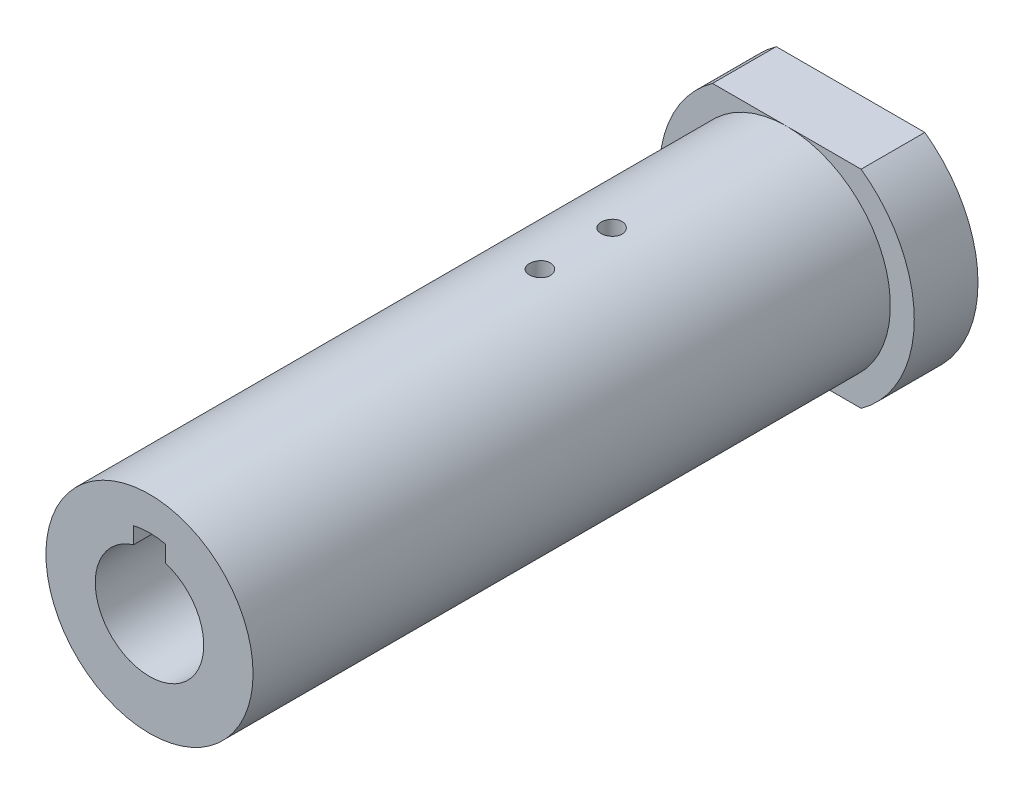
ISO-10303-21;
HEADER;
FILE_DESCRIPTION(('STEP AP214'),'2;1');
FILE_NAME('part.step','',(''),(''),'','','');
FILE_SCHEMA(('AUTOMOTIVE_DESIGN { 1 0 10303 214 1 1 1 1 }'));
ENDSEC;
DATA;
#1=APPLICATION_CONTEXT('core data for automotive mechanical design processes');
#2=APPLICATION_PROTOCOL_DEFINITION('international standard','automotive_design',2000,#1);
#3=PRODUCT_CONTEXT('',#1,'mechanical');
#4=PRODUCT('Part','Part','',(#3));
#5=PRODUCT_RELATED_PRODUCT_CATEGORY('part','',(#4));
#6=PRODUCT_DEFINITION_FORMATION('','',#4);
#7=PRODUCT_DEFINITION_CONTEXT('part definition',#1,'design');
#8=PRODUCT_DEFINITION('design','',#6,#7);
#9=PRODUCT_DEFINITION_SHAPE('','',#8);
#10=(LENGTH_UNIT() NAMED_UNIT(*) SI_UNIT(.MILLI.,.METRE.));
#11=(NAMED_UNIT(*) PLANE_ANGLE_UNIT() SI_UNIT($,.RADIAN.));
#12=(NAMED_UNIT(*) SI_UNIT($,.STERADIAN.) SOLID_ANGLE_UNIT());
#13=UNCERTAINTY_MEASURE_WITH_UNIT(LENGTH_MEASURE(1.E-05),#10,'distance_accuracy_value','');
#14=(GEOMETRIC_REPRESENTATION_CONTEXT(3) GLOBAL_UNCERTAINTY_ASSIGNED_CONTEXT((#13)) GLOBAL_UNIT_ASSIGNED_CONTEXT((#10,
#11,#12)) REPRESENTATION_CONTEXT('',''));
#15=CARTESIAN_POINT('',(0.,0.,0.));
#16=DIRECTION('',(0.,0.,1.));
#17=DIRECTION('',(1.,0.,0.));
#18=AXIS2_PLACEMENT_3D('',#15,#16,#17);
#19=CARTESIAN_POINT('',(0.,0.,139.7));
#20=DIRECTION('',(0.,0.,-1.));
#21=DIRECTION('',(-1.,0.,0.));
#22=AXIS2_PLACEMENT_3D('',#19,#20,#21);
#23=CYLINDRICAL_SURFACE('',#22,13.9954);
#24=CARTESIAN_POINT('',(0.,0.,76.2));
#25=DIRECTION('',(0.,0.,1.));
#26=DIRECTION('',(1.,0.,0.));
#27=AXIS2_PLACEMENT_3D('',#24,#25,#26);
#28=CIRCLE('',#27,13.9954);
#29=CARTESIAN_POINT('',(3.175,13.6305024177394,76.2));
#30=VERTEX_POINT('',#29);
#31=CARTESIAN_POINT('',(-3.175,13.6305024177394,76.2));
#32=VERTEX_POINT('',#31);
#33=EDGE_CURVE('E85',#30,#32,#28,.T.);
#34=ORIENTED_EDGE('',*,*,#33,.F.);
#35=DIRECTION('',(0.,0.,1.));
#36=VECTOR('',#35,1.);
#37=CARTESIAN_POINT('',(3.175,13.6305024177394,76.2));
#38=LINE('',#37,#36);
#39=CARTESIAN_POINT('',(3.175,13.6305024177394,139.7));
#40=VERTEX_POINT('',#39);
#41=EDGE_CURVE('E170',#30,#40,#38,.T.);
#42=ORIENTED_EDGE('',*,*,#41,.T.);
#43=CARTESIAN_POINT('',(0.,0.,139.7));
#44=DIRECTION('',(0.,0.,1.));
#45=DIRECTION('',(1.,0.,0.));
#46=AXIS2_PLACEMENT_3D('',#43,#44,#45);
#47=CIRCLE('',#46,13.9954);
#48=CARTESIAN_POINT('',(-3.175,13.6305024177394,139.7));
#49=VERTEX_POINT('',#48);
#50=EDGE_CURVE('E214',#40,#49,#47,.T.);
#51=ORIENTED_EDGE('',*,*,#50,.T.);
#52=DIRECTION('',(0.,0.,1.));
#53=VECTOR('',#52,1.);
#54=CARTESIAN_POINT('',(-3.175,13.6305024177394,76.2));
#55=LINE('',#54,#53);
#56=EDGE_CURVE('E81',#32,#49,#55,.T.);
#57=ORIENTED_EDGE('',*,*,#56,.F.);
#58=EDGE_LOOP('',(#34,#42,#51,#57));
#59=FACE_BOUND('',#58,.T.);
#60=ADVANCED_FACE('F59',(#59),#23,.F.);
#61=CARTESIAN_POINT('',(0.,0.,76.2));
#62=DIRECTION('',(0.,0.,-1.));
#63=DIRECTION('',(-1.,0.,0.));
#64=AXIS2_PLACEMENT_3D('',#61,#62,#63);
#65=CYLINDRICAL_SURFACE('',#64,20.6375);
#66=CARTESIAN_POINT('',(0.,20.6375,49.7078));
#67=CARTESIAN_POINT('',(-0.116673418011042,20.6374986459804,49.7077949504187));
#68=CARTESIAN_POINT('',(-0.233423834962747,20.636500074814,49.6979633475816));
#69=CARTESIAN_POINT('',(-0.463687496225415,20.6326125988908,49.6588917995434));
#70=CARTESIAN_POINT('',(-0.577197036868939,20.6297216151596,49.6296305086865));
#71=CARTESIAN_POINT('',(-0.797611189449056,20.6223756326464,49.5525604470288));
#72=CARTESIAN_POINT('',(-0.904519760143806,20.6179215821995,49.5047629205867));
#73=CARTESIAN_POINT('',(-1.10877358653536,20.6079474188847,49.3919991034111));
#74=CARTESIAN_POINT('',(-1.20612073002144,20.6024275170971,49.327036211158));
#75=CARTESIAN_POINT('',(-1.38886806487481,20.5909173135576,49.1815304450844));
#76=CARTESIAN_POINT('',(-1.47422832527567,20.5849255387146,49.1009375319585));
#77=CARTESIAN_POINT('',(-1.63023560796191,20.5731590705469,48.9265662119255));
#78=CARTESIAN_POINT('',(-1.70088194752998,20.5673843873054,48.8327871935288));
#79=CARTESIAN_POINT('',(-1.82559763940498,20.5566908826122,48.6344554959014));
#80=CARTESIAN_POINT('',(-1.8796308187165,20.5517739386998,48.5298799603165));
#81=CARTESIAN_POINT('',(-1.96935540647831,20.5433709090172,48.3130821855939));
#82=CARTESIAN_POINT('',(-2.00504727599724,20.539884787279,48.2008601387567));
#83=CARTESIAN_POINT('',(-2.05695761499952,20.5347514402553,47.9723623627359));
#84=CARTESIAN_POINT('',(-2.07324234681939,20.5330979590947,47.8561018299945));
#85=CARTESIAN_POINT('',(-2.0860809824995,20.5317976875389,47.6224868884926));
#86=CARTESIAN_POINT('',(-2.08263541399277,20.5321508434817,47.5051325090677));
#87=CARTESIAN_POINT('',(-2.0561658646637,20.534818231589,47.2731180686703));
#88=CARTESIAN_POINT('',(-2.03321425471611,20.5371252145984,47.1584496561484));
#89=CARTESIAN_POINT('',(-1.96849675189874,20.5434289934423,46.9346007427224));
#90=CARTESIAN_POINT('',(-1.92673060063094,20.5474258124849,46.8254203172129));
#91=CARTESIAN_POINT('',(-1.82548978907741,20.5566672575282,46.6154181219638));
#92=CARTESIAN_POINT('',(-1.76598304210207,20.561914140986,46.5146119244072));
#93=CARTESIAN_POINT('',(-1.63097327104134,20.5730626162391,46.3243901148623));
#94=CARTESIAN_POINT('',(-1.55546977004071,20.5789642275516,46.2349748426019));
#95=CARTESIAN_POINT('',(-1.39020565250953,20.5907894916058,46.0696525265471));
#96=CARTESIAN_POINT('',(-1.30038253874277,20.5967131243251,45.9938079425316));
#97=CARTESIAN_POINT('',(-1.10924589971797,20.6078899655561,45.8582641376088));
#98=CARTESIAN_POINT('',(-1.00793236121212,20.6131431732947,45.7985649353165));
#99=CARTESIAN_POINT('',(-0.79664735651349,20.6223890415078,45.6970089563934));
#100=CARTESIAN_POINT('',(-0.686674344828594,20.6263814763269,45.655155373334));
#101=CARTESIAN_POINT('',(-0.461212637273692,20.6326536611877,45.5905246049421));
#102=CARTESIAN_POINT('',(-0.345724109529263,20.6349334633989,45.5677468385269));
#103=CARTESIAN_POINT('',(-0.113050542441041,20.6375168043262,45.5419935754728));
#104=CARTESIAN_POINT('',(0.00412486606485471,20.6378289441684,45.5389318938097));
#105=CARTESIAN_POINT('',(0.237320905162869,20.6364648588707,45.5524713116496));
#106=CARTESIAN_POINT('',(0.353341551628187,20.6347886611004,45.5690721404968));
#107=CARTESIAN_POINT('',(0.580685727724372,20.6296417610507,45.6213938395537));
#108=CARTESIAN_POINT('',(0.692018643182737,20.6261748489762,45.657074331577));
#109=CARTESIAN_POINT('',(0.90711883716797,20.6178354352133,45.7465010066138));
#110=CARTESIAN_POINT('',(1.01088594303045,20.6129629014589,45.8002476017689));
#111=CARTESIAN_POINT('',(1.20829846251801,20.6023357846414,45.9244943803606));
#112=CARTESIAN_POINT('',(1.30190809449043,20.5965782457408,45.9950511594507));
#113=CARTESIAN_POINT('',(1.47598617206879,20.5848365970282,46.150834344618));
#114=CARTESIAN_POINT('',(1.55645428151322,20.5788524814251,46.2360611258409));
#115=CARTESIAN_POINT('',(1.70226458098479,20.5673062282623,46.4191412107419));
#116=CARTESIAN_POINT('',(1.76755018876891,20.5617457195553,46.5170396953866));
#117=CARTESIAN_POINT('',(1.88075322924861,20.5517010732555,46.7224614784268));
#118=CARTESIAN_POINT('',(1.9286709032521,20.5472169207081,46.8299846430723));
#119=CARTESIAN_POINT('',(2.00568324864352,20.5398428715695,47.0514099306058));
#120=CARTESIAN_POINT('',(2.03481152808786,20.5369501298389,47.1653002658317));
#121=CARTESIAN_POINT('',(2.07352725850035,20.5330775964736,47.3963860159647));
#122=CARTESIAN_POINT('',(2.08311528123521,20.5320977488658,47.5135813340633));
#123=CARTESIAN_POINT('',(2.08247030884604,20.5321631320961,47.74738789567));
#124=CARTESIAN_POINT('',(2.07232619736002,20.5331992818547,47.86399939709));
#125=CARTESIAN_POINT('',(2.03269133502858,20.53716054223,48.0938525781022));
#126=CARTESIAN_POINT('',(2.00320056295864,20.540085654919,48.2070942539975));
#127=CARTESIAN_POINT('',(1.92573414696349,20.5474927240546,48.4269922336439));
#128=CARTESIAN_POINT('',(1.87776116710576,20.5519744561174,48.5336494839195));
#129=CARTESIAN_POINT('',(1.76470126627152,20.5619902328133,48.7374123116306));
#130=CARTESIAN_POINT('',(1.69961443073725,20.5675242721927,48.8345179367499));
#131=CARTESIAN_POINT('',(1.55384072096024,20.5790509746715,49.016876534138));
#132=CARTESIAN_POINT('',(1.47308760985552,20.5850455173689,49.1020764406113));
#133=CARTESIAN_POINT('',(1.29840503046927,20.5968006473796,49.2577550507243));
#134=CARTESIAN_POINT('',(1.20447241243506,20.6025611783413,49.3282302252689));
#135=CARTESIAN_POINT('',(1.00583379018322,20.6132145818982,49.4526011168685));
#136=CARTESIAN_POINT('',(0.901100832066924,20.6181051964401,49.5064539457192));
#137=CARTESIAN_POINT('',(0.684095977927792,20.6264432455812,49.5957369223724));
#138=CARTESIAN_POINT('',(0.571832733792435,20.629892304573,49.6311878170491));
#139=CARTESIAN_POINT('',(0.382446435795857,20.6340931480584,49.6738325200026));
#140=CARTESIAN_POINT('',(0.306533516549245,20.6353647512845,49.6865528912934));
#141=CARTESIAN_POINT('',(0.15375821092186,20.6370686216807,49.7035382774639));
#142=CARTESIAN_POINT('',(0.0768958285488996,20.6375008923923,49.7078033280223));
#143=CARTESIAN_POINT('',(0.,20.6375,49.7078));
#144=B_SPLINE_CURVE_WITH_KNOTS('',3,(#66,#67,#68,#69,#70,#71,#72,#73,#74,#75,#76,#77,#78,#79,
#80,#81,#82,#83,#84,#85,#86,#87,#88,#89,#90,#91,#92,#93,#94,#95,#96,#97,#98,#99,#100,#101,#102,
#103,#104,#105,#106,#107,#108,#109,#110,#111,#112,#113,#114,#115,#116,#117,#118,#119,#120,#121,
#122,#123,#124,#125,#126,#127,#128,#129,#130,#131,#132,#133,#134,#135,#136,#137,#138,#139,#140,
#141,#142,#143),.UNSPECIFIED.,.T.,.F.,(4,2,2,2,2,2,2,2,2,2,2,2,2,2,2,2,2,2,2,2,2,2,2,2,2,2,2,2,
2,2,2,2,2,2,2,2,2,2,4),(0.,0.349739456527983,0.699863777554444,1.04977603930366,
1.39961907560476,1.75060119140743,2.10159958894878,2.45335691427366,2.80510539659808,
3.15564942154073,3.5061840721839,3.85542382632241,4.20466837704954,4.55454846432507,
4.90443898413191,5.25590063980617,5.60736270070037,5.95888763128523,6.31040185341468,
6.66037845052916,7.01035023025091,7.35958428093985,7.70882629923918,8.05926116987492,
8.40970500326762,8.76143466008964,9.11315942983642,9.46425332208431,9.81533694083982,
10.1648427609253,10.5143489644419,10.8638048081767,11.2132589072597,11.5642240277778,
11.9152731683018,12.2672206408273,12.6187704509955,12.8492738443756,13.0797762651019),.UNSPECIFIED.);
#145=CARTESIAN_POINT('',(0.,20.6375,49.7078));
#146=VERTEX_POINT('',#145);
#147=EDGE_CURVE('E226',#146,#146,#144,.T.);
#148=ORIENTED_EDGE('',*,*,#147,.T.);
#149=EDGE_LOOP('',(#148));
#150=FACE_BOUND('',#149,.T.);
#151=CARTESIAN_POINT('',(0.,20.6375,63.9953));
#152=CARTESIAN_POINT('',(-0.116673418011042,20.6374986459804,63.9952949504187));
#153=CARTESIAN_POINT('',(-0.233423834962747,20.636500074814,63.9854633475816));
#154=CARTESIAN_POINT('',(-0.463687496225415,20.6326125988908,63.9463917995434));
#155=CARTESIAN_POINT('',(-0.57719703686894,20.6297216151596,63.9171305086865));
#156=CARTESIAN_POINT('',(-0.797611189449061,20.6223756326464,63.8400604470288));
#157=CARTESIAN_POINT('',(-0.904519760143815,20.6179215821995,63.7922629205867));
#158=CARTESIAN_POINT('',(-1.10877358653537,20.6079474188847,63.6794991034111));
#159=CARTESIAN_POINT('',(-1.20612073002145,20.6024275170971,63.614536211158));
#160=CARTESIAN_POINT('',(-1.38886806487481,20.5909173135576,63.4690304450844));
#161=CARTESIAN_POINT('',(-1.47422832527567,20.5849255387146,63.3884375319585));
#162=CARTESIAN_POINT('',(-1.63023560796192,20.5731590705469,63.2140662119255));
#163=CARTESIAN_POINT('',(-1.70088194752998,20.5673843873054,63.1202871935288));
#164=CARTESIAN_POINT('',(-1.82559763940498,20.5566908826122,62.9219554959014));
#165=CARTESIAN_POINT('',(-1.87963081871651,20.5517739386998,62.8173799603165));
#166=CARTESIAN_POINT('',(-1.96935540647831,20.5433709090171,62.6005821855939));
#167=CARTESIAN_POINT('',(-2.00504727599724,20.539884787279,62.4883601387567));
#168=CARTESIAN_POINT('',(-2.05695761499952,20.5347514402553,62.2598623627359));
#169=CARTESIAN_POINT('',(-2.07324234681939,20.5330979590947,62.1436018299945));
#170=CARTESIAN_POINT('',(-2.0860809824995,20.5317976875389,61.9099868884926));
#171=CARTESIAN_POINT('',(-2.08263541399277,20.5321508434817,61.7926325090677));
#172=CARTESIAN_POINT('',(-2.0561658646637,20.534818231589,61.5606180686703));
#173=CARTESIAN_POINT('',(-2.03321425471611,20.5371252145984,61.4459496561484));
#174=CARTESIAN_POINT('',(-1.96849675189874,20.5434289934423,61.2221007427224));
#175=CARTESIAN_POINT('',(-1.92673060063094,20.5474258124849,61.1129203172129));
#176=CARTESIAN_POINT('',(-1.82548978907741,20.5566672575282,60.9029181219638));
#177=CARTESIAN_POINT('',(-1.76598304210206,20.561914140986,60.8021119244072));
#178=CARTESIAN_POINT('',(-1.63097327104134,20.5730626162391,60.6118901148623));
#179=CARTESIAN_POINT('',(-1.5554697700407,20.5789642275516,60.5224748426019));
#180=CARTESIAN_POINT('',(-1.39020565250953,20.5907894916058,60.3571525265471));
#181=CARTESIAN_POINT('',(-1.30038253874277,20.5967131243251,60.2813079425316));
#182=CARTESIAN_POINT('',(-1.10924589971797,20.6078899655561,60.1457641376088));
#183=CARTESIAN_POINT('',(-1.00793236121212,20.6131431732947,60.0860649353165));
#184=CARTESIAN_POINT('',(-0.796647356513486,20.6223890415078,59.9845089563934));
#185=CARTESIAN_POINT('',(-0.686674344828588,20.6263814763269,59.942655373334));
#186=CARTESIAN_POINT('',(-0.461212637273684,20.6326536611877,59.8780246049421));
#187=CARTESIAN_POINT('',(-0.345724109529257,20.6349334633989,59.8552468385269));
#188=CARTESIAN_POINT('',(-0.113050542441036,20.6375168043262,59.8294935754728));
#189=CARTESIAN_POINT('',(0.00412486606486031,20.6378289441684,59.8264318938097));
#190=CARTESIAN_POINT('',(0.237320905162875,20.6364648588707,59.8399713116496));
#191=CARTESIAN_POINT('',(0.353341551628194,20.6347886611004,59.8565721404968));
#192=CARTESIAN_POINT('',(0.580685727724378,20.6296417610507,59.9088938395537));
#193=CARTESIAN_POINT('',(0.692018643182742,20.6261748489762,59.944574331577));
#194=CARTESIAN_POINT('',(0.907118837167973,20.6178354352133,60.0340010066138));
#195=CARTESIAN_POINT('',(1.01088594303045,20.6129629014589,60.0877476017689));
#196=CARTESIAN_POINT('',(1.20829846251801,20.6023357846414,60.2119943803606));
#197=CARTESIAN_POINT('',(1.30190809449044,20.5965782457408,60.2825511594507));
#198=CARTESIAN_POINT('',(1.47598617206881,20.5848365970282,60.438334344618));
#199=CARTESIAN_POINT('',(1.55645428151322,20.5788524814251,60.5235611258409));
#200=CARTESIAN_POINT('',(1.70226458098479,20.5673062282623,60.7066412107419));
#201=CARTESIAN_POINT('',(1.76755018876891,20.5617457195553,60.8045396953866));
#202=CARTESIAN_POINT('',(1.88075322924861,20.5517010732555,61.0099614784268));
#203=CARTESIAN_POINT('',(1.9286709032521,20.5472169207081,61.1174846430723));
#204=CARTESIAN_POINT('',(2.00568324864353,20.5398428715695,61.3389099306059));
#205=CARTESIAN_POINT('',(2.03481152808786,20.5369501298389,61.4528002658317));
#206=CARTESIAN_POINT('',(2.07352725850035,20.5330775964736,61.6838860159648));
#207=CARTESIAN_POINT('',(2.08311528123521,20.5320977488658,61.8010813340633));
#208=CARTESIAN_POINT('',(2.08247030884604,20.5321631320961,62.0348878956701));
#209=CARTESIAN_POINT('',(2.07232619736002,20.5331992818547,62.15149939709));
#210=CARTESIAN_POINT('',(2.03269133502858,20.53716054223,62.3813525781022));
#211=CARTESIAN_POINT('',(2.00320056295864,20.540085654919,62.4945942539975));
#212=CARTESIAN_POINT('',(1.92573414696349,20.5474927240546,62.7144922336439));
#213=CARTESIAN_POINT('',(1.87776116710575,20.5519744561174,62.8211494839196));
#214=CARTESIAN_POINT('',(1.76470126627151,20.5619902328133,63.0249123116306));
#215=CARTESIAN_POINT('',(1.69961443073724,20.5675242721927,63.1220179367499));
#216=CARTESIAN_POINT('',(1.55384072096023,20.5790509746715,63.304376534138));
#217=CARTESIAN_POINT('',(1.47308760985551,20.5850455173689,63.3895764406113));
#218=CARTESIAN_POINT('',(1.29840503046926,20.5968006473796,63.5452550507243));
#219=CARTESIAN_POINT('',(1.20447241243505,20.6025611783413,63.6157302252689));
#220=CARTESIAN_POINT('',(1.00583379018322,20.6132145818982,63.7401011168685));
#221=CARTESIAN_POINT('',(0.901100832066918,20.6181051964401,63.7939539457192));
#222=CARTESIAN_POINT('',(0.684095977927787,20.6264432455812,63.8832369223724));
#223=CARTESIAN_POINT('',(0.571832733792429,20.629892304573,63.9186878170491));
#224=CARTESIAN_POINT('',(0.382446435795853,20.6340931480584,63.9613325200026));
#225=CARTESIAN_POINT('',(0.306533516549242,20.6353647512845,63.9740528912934));
#226=CARTESIAN_POINT('',(0.153758210921859,20.6370686216807,63.9910382774639));
#227=CARTESIAN_POINT('',(0.0768958285488988,20.6375008923923,63.9953033280223));
#228=CARTESIAN_POINT('',(0.,20.6375,63.9953));
#229=B_SPLINE_CURVE_WITH_KNOTS('',3,(#151,#152,#153,#154,#155,#156,#157,#158,#159,#160,#161,
#162,#163,#164,#165,#166,#167,#168,#169,#170,#171,#172,#173,#174,#175,#176,#177,#178,#179,#180,
#181,#182,#183,#184,#185,#186,#187,#188,#189,#190,#191,#192,#193,#194,#195,#196,#197,#198,#199,
#200,#201,#202,#203,#204,#205,#206,#207,#208,#209,#210,#211,#212,#213,#214,#215,#216,#217,#218,
#219,#220,#221,#222,#223,#224,#225,#226,#227,#228),.UNSPECIFIED.,.T.,.F.,(4,2,2,2,2,2,2,2,2,2,2,
2,2,2,2,2,2,2,2,2,2,2,2,2,2,2,2,2,2,2,2,2,2,2,2,2,2,2,4),(0.,0.349739456527983,
0.699863777554447,1.04977603930368,1.39961907560477,1.75060119140743,2.10159958894878,
2.45335691427367,2.80510539659808,3.15564942154073,3.5061840721839,3.85542382632242,
4.20466837704954,4.55454846432508,4.90443898413191,5.25590063980617,5.60736270070037,
5.95888763128524,6.31040185341469,6.66037845052916,7.01035023025092,7.35958428093986,
7.70882629923919,8.05926116987493,8.40970500326763,8.76143466008966,9.11315942983643,
9.46425332208432,9.81533694083982,10.1648427609253,10.5143489644419,10.8638048081768,
11.2132589072597,11.5642240277778,11.9152731683019,12.2672206408273,12.6187704509955,
12.8492738443756,13.0797762651019),.UNSPECIFIED.);
#230=CARTESIAN_POINT('',(0.,20.6375,63.9953));
#231=VERTEX_POINT('',#230);
#232=EDGE_CURVE('E164',#231,#231,#229,.T.);
#233=ORIENTED_EDGE('',*,*,#232,.T.);
#234=EDGE_LOOP('',(#233));
#235=FACE_BOUND('',#234,.T.);
#236=CARTESIAN_POINT('',(0.,0.,139.7));
#237=DIRECTION('',(0.,0.,1.));
#238=DIRECTION('',(1.,0.,0.));
#239=AXIS2_PLACEMENT_3D('',#236,#237,#238);
#240=CIRCLE('',#239,20.6375);
#241=CARTESIAN_POINT('',(20.6375,0.,139.7));
#242=VERTEX_POINT('',#241);
#243=EDGE_CURVE('E216',#242,#242,#240,.T.);
#244=ORIENTED_EDGE('',*,*,#243,.F.);
#245=EDGE_LOOP('',(#244));
#246=FACE_BOUND('',#245,.T.);
#247=CARTESIAN_POINT('',(0.,0.,12.7));
#248=DIRECTION('',(0.,0.,-1.));
#249=DIRECTION('',(-1.,0.,0.));
#250=AXIS2_PLACEMENT_3D('',#247,#248,#249);
#251=CIRCLE('',#250,20.6375);
#252=CARTESIAN_POINT('',(0.,-20.6375,12.7));
#253=VERTEX_POINT('',#252);
#254=CARTESIAN_POINT('',(0.,20.6375,12.7));
#255=VERTEX_POINT('',#254);
#256=EDGE_CURVE('E185',#253,#255,#251,.T.);
#257=ORIENTED_EDGE('',*,*,#256,.F.);
#258=CARTESIAN_POINT('',(0.,0.,12.7));
#259=DIRECTION('',(0.,0.,-1.));
#260=DIRECTION('',(-1.,0.,0.));
#261=AXIS2_PLACEMENT_3D('',#258,#259,#260);
#262=CIRCLE('',#261,20.6375);
#263=EDGE_CURVE('E198',#255,#253,#262,.T.);
#264=ORIENTED_EDGE('',*,*,#263,.F.);
#265=EDGE_LOOP('',(#257,#264));
#266=FACE_BOUND('',#265,.T.);
#267=ADVANCED_FACE('F61',(#150,#235,#246,#266),#65,.T.);
#268=CARTESIAN_POINT('',(0.,0.,0.));
#269=DIRECTION('',(0.,0.,1.));
#270=DIRECTION('',(1.,0.,0.));
#271=AXIS2_PLACEMENT_3D('',#268,#269,#270);
#272=PLANE('',#271);
#273=DIRECTION('',(-1.,0.,0.));
#274=VECTOR('',#273,1.);
#275=CARTESIAN_POINT('',(0.,-20.6375,0.));
#276=LINE('',#275,#274);
#277=CARTESIAN_POINT('',(14.8072142467785,-20.6375,0.));
#278=VERTEX_POINT('',#277);
#279=CARTESIAN_POINT('',(-14.8072142467785,-20.6375,0.));
#280=VERTEX_POINT('',#279);
#281=EDGE_CURVE('E207',#278,#280,#276,.T.);
#282=ORIENTED_EDGE('',*,*,#281,.T.);
#283=CARTESIAN_POINT('',(0.,0.,0.));
#284=DIRECTION('',(0.,0.,-1.));
#285=DIRECTION('',(-1.,0.,0.));
#286=AXIS2_PLACEMENT_3D('',#283,#284,#285);
#287=CIRCLE('',#286,25.4);
#288=CARTESIAN_POINT('',(-14.8072142467785,20.6375,0.));
#289=VERTEX_POINT('',#288);
#290=EDGE_CURVE('E169',#289,#280,#287,.F.);
#291=ORIENTED_EDGE('',*,*,#290,.F.);
#292=DIRECTION('',(-1.,0.,0.));
#293=VECTOR('',#292,1.);
#294=CARTESIAN_POINT('',(0.,20.6375,0.));
#295=LINE('',#294,#293);
#296=CARTESIAN_POINT('',(14.8072142467785,20.6375,0.));
#297=VERTEX_POINT('',#296);
#298=EDGE_CURVE('E195',#297,#289,#295,.T.);
#299=ORIENTED_EDGE('',*,*,#298,.F.);
#300=CARTESIAN_POINT('',(0.,0.,0.));
#301=DIRECTION('',(0.,0.,-1.));
#302=DIRECTION('',(-1.,0.,0.));
#303=AXIS2_PLACEMENT_3D('',#300,#301,#302);
#304=CIRCLE('',#303,25.4);
#305=EDGE_CURVE('E189',#278,#297,#304,.F.);
#306=ORIENTED_EDGE('',*,*,#305,.F.);
#307=EDGE_LOOP('',(#282,#291,#299,#306));
#308=FACE_BOUND('',#307,.T.);
#309=CARTESIAN_POINT('',(0.,0.,0.));
#310=DIRECTION('',(0.,0.,1.));
#311=DIRECTION('',(1.,0.,0.));
#312=AXIS2_PLACEMENT_3D('',#309,#310,#311);
#313=CIRCLE('',#312,15.875);
#314=CARTESIAN_POINT('',(15.875,0.,0.));
#315=VERTEX_POINT('',#314);
#316=EDGE_CURVE('E12',#315,#315,#313,.T.);
#317=ORIENTED_EDGE('',*,*,#316,.T.);
#318=EDGE_LOOP('',(#317));
#319=FACE_BOUND('',#318,.T.);
#320=ADVANCED_FACE('F257',(#308,#319),#272,.F.);
#321=CARTESIAN_POINT('',(0.,0.,76.2));
#322=DIRECTION('',(0.,0.,-1.));
#323=DIRECTION('',(-1.,0.,0.));
#324=AXIS2_PLACEMENT_3D('',#321,#322,#323);
#325=CYLINDRICAL_SURFACE('',#324,15.875);
#326=CARTESIAN_POINT('',(0.,15.875,49.7078));
#327=CARTESIAN_POINT('',(-0.116455193801769,15.8749983107207,49.7077950832706));
#328=CARTESIAN_POINT('',(-0.232981960090031,15.8737050594194,49.6980000532931));
#329=CARTESIAN_POINT('',(-0.46278958237329,15.8686704351037,49.6590822885931));
#330=CARTESIAN_POINT('',(-0.576066976997715,15.8649265457827,49.6299396874135));
#331=CARTESIAN_POINT('',(-0.796015917447345,15.855412174548,49.5532030640755));
#332=CARTESIAN_POINT('',(-0.902691977848529,15.8496430960647,49.5056218172968));
#333=CARTESIAN_POINT('',(-1.10652574470892,15.8367190198169,49.3933872951519));
#334=CARTESIAN_POINT('',(-1.20368500790217,15.8295642492924,49.3287368183431));
#335=CARTESIAN_POINT('',(-1.38633343961909,15.8146185468358,49.1837818690942));
#336=CARTESIAN_POINT('',(-1.47175681797913,15.8068243909682,49.1033948226165));
#337=CARTESIAN_POINT('',(-1.62794176935066,15.7915041832127,48.9294260533638));
#338=CARTESIAN_POINT('',(-1.69870257394012,15.7839781453931,48.8358436394903));
#339=CARTESIAN_POINT('',(-1.82380150817527,15.7700147106223,48.6377094928707));
#340=CARTESIAN_POINT('',(-1.87807750798419,15.7635814714985,48.5331182139728));
#341=CARTESIAN_POINT('',(-1.96826930375697,15.752574960099,48.3162065072552));
#342=CARTESIAN_POINT('',(-2.00418586553192,15.748001610245,48.203886402043));
#343=CARTESIAN_POINT('',(-2.05643824045801,15.7412637322438,47.975390568539));
#344=CARTESIAN_POINT('',(-2.07288553874911,15.7390854943352,47.8592407460422));
#345=CARTESIAN_POINT('',(-2.08607757465719,15.7373426043562,47.6258106981711));
#346=CARTESIAN_POINT('',(-2.08282318254673,15.7377778368425,47.5085305229557));
#347=CARTESIAN_POINT('',(-2.0567956376116,15.7412001659,47.2769483135576));
#348=CARTESIAN_POINT('',(-2.0341456024737,15.7441711657955,47.1626321703774));
#349=CARTESIAN_POINT('',(-1.9701619632951,15.7523051599738,46.9394373967269));
#350=CARTESIAN_POINT('',(-1.92882794565464,15.7574682027808,46.8305588866865));
#351=CARTESIAN_POINT('',(-1.82851832630454,15.7694226832183,46.6209493896568));
#352=CARTESIAN_POINT('',(-1.76948953710508,15.7762190178585,46.5202441464835));
#353=CARTESIAN_POINT('',(-1.63550399324765,15.7906705829124,46.3301220442862));
#354=CARTESIAN_POINT('',(-1.56054643645831,15.7983258565707,46.2407057541062));
#355=CARTESIAN_POINT('',(-1.39615030954059,15.8137042032064,46.0749853859938));
#356=CARTESIAN_POINT('',(-1.30660567921232,15.821427348069,45.9987864879984));
#357=CARTESIAN_POINT('',(-1.1159415662087,15.836016718836,45.8624839264925));
#358=CARTESIAN_POINT('',(-1.01482205201077,15.8428829424066,45.8023803068168));
#359=CARTESIAN_POINT('',(-0.803795145046001,15.8549897225195,45.6999731180769));
#360=CARTESIAN_POINT('',(-0.69388434621067,15.860229645098,45.6576764882396));
#361=CARTESIAN_POINT('',(-0.46843629095581,15.8684878004502,45.5921692526615));
#362=CARTESIAN_POINT('',(-0.352899325229191,15.8715061478786,45.5689576619404));
#363=CARTESIAN_POINT('',(-0.120387654676626,15.8749661002299,45.5424165356929));
#364=CARTESIAN_POINT('',(-0.00342974974721174,15.8754264738175,45.5389421776015));
#365=CARTESIAN_POINT('',(0.229400476390119,15.8737693779004,45.5515914394684));
#366=CARTESIAN_POINT('',(0.345272823060402,15.8716519690124,45.5677145985907));
#367=CARTESIAN_POINT('',(0.572212789335671,15.8650888885358,45.6189808740085));
#368=CARTESIAN_POINT('',(0.683296353739912,15.860651714468,45.654054588213));
#369=CARTESIAN_POINT('',(0.898005279374566,15.8499456490105,45.7421539663133));
#370=CARTESIAN_POINT('',(1.00163036399025,15.8436766897285,45.7951802956071));
#371=CARTESIAN_POINT('',(1.19912528572521,15.829958640534,45.918027604037));
#372=CARTESIAN_POINT('',(1.29293665396215,15.8225030785615,45.9879418450752));
#373=CARTESIAN_POINT('',(1.46754547257663,15.8072651538634,46.1424489183122));
#374=CARTESIAN_POINT('',(1.54834235138383,15.7994827768037,46.2270423948548));
#375=CARTESIAN_POINT('',(1.69514555129436,15.7844100585279,46.4091461908071));
#376=CARTESIAN_POINT('',(1.76105561581864,15.7771231211395,46.5067344307752));
#377=CARTESIAN_POINT('',(1.8755483218782,15.7639233392231,46.711681172659));
#378=CARTESIAN_POINT('',(1.92413134011834,15.7580104648228,46.8190394621018));
#379=CARTESIAN_POINT('',(2.00243655065204,15.7482518420474,47.0401736832784));
#380=CARTESIAN_POINT('',(2.03221217289402,15.7444002425988,47.1539304257761));
#381=CARTESIAN_POINT('',(2.07222900546333,15.7391837757775,47.3848832599816));
#382=CARTESIAN_POINT('',(2.08247122483133,15.737818779954,47.5020791737141));
#383=CARTESIAN_POINT('',(2.08311072460907,15.737734067321,47.7356255948397));
#384=CARTESIAN_POINT('',(2.07365924886421,15.7389941900828,47.8519757095752));
#385=CARTESIAN_POINT('',(2.03550081362729,15.743974278668,48.0814179842996));
#386=CARTESIAN_POINT('',(2.00679385882627,15.747694243892,48.1945101450822));
#387=CARTESIAN_POINT('',(1.93098811248074,15.7571684467508,48.4142011959106));
#388=CARTESIAN_POINT('',(1.88389737758497,15.7629217931566,48.5208029067565));
#389=CARTESIAN_POINT('',(1.77267566657571,15.7758158732727,48.7246160800128));
#390=CARTESIAN_POINT('',(1.70854439156995,15.7829566313177,48.8218273776739));
#391=CARTESIAN_POINT('',(1.56450347010289,15.797886577206,49.0048724083006));
#392=CARTESIAN_POINT('',(1.48448122936603,15.805680148462,49.090617188791));
#393=CARTESIAN_POINT('',(1.3111660420103,15.8209993536083,49.2475181213986));
#394=CARTESIAN_POINT('',(1.21786998266659,15.8285249241331,49.3186708420799));
#395=CARTESIAN_POINT('',(1.02020445348884,15.8424953139972,49.4446248263926));
#396=CARTESIAN_POINT('',(0.915790294378222,15.8489354806926,49.4993564441729));
#397=CARTESIAN_POINT('',(0.699224235295676,15.859962768471,49.5904288982899));
#398=CARTESIAN_POINT('',(0.587080800804966,15.8645518803134,49.6267895028458));
#399=CARTESIAN_POINT('',(0.39531182994476,15.8702672066898,49.6714885297531));
#400=CARTESIAN_POINT('',(0.316890129138791,15.8720332505705,49.6850854791208));
#401=CARTESIAN_POINT('',(0.15899006793359,15.8744002190062,49.7032428546435));
#402=CARTESIAN_POINT('',(0.0795117164479264,15.8750011533835,49.7078033569786));
#403=CARTESIAN_POINT('',(0.,15.875,49.7078));
#404=B_SPLINE_CURVE_WITH_KNOTS('',3,(#326,#327,#328,#329,#330,#331,#332,#333,#334,#335,#336,
#337,#338,#339,#340,#341,#342,#343,#344,#345,#346,#347,#348,#349,#350,#351,#352,#353,#354,#355,
#356,#357,#358,#359,#360,#361,#362,#363,#364,#365,#366,#367,#368,#369,#370,#371,#372,#373,#374,
#375,#376,#377,#378,#379,#380,#381,#382,#383,#384,#385,#386,#387,#388,#389,#390,#391,#392,#393,
#394,#395,#396,#397,#398,#399,#400,#401,#402,#403),.UNSPECIFIED.,.T.,.F.,(4,2,2,2,2,2,2,2,2,2,2,
2,2,2,2,2,2,2,2,2,2,2,2,2,2,2,2,2,2,2,2,2,2,2,2,2,2,2,4),(0.,0.349075124777894,0.698509242115,
1.04770168254154,1.39683690720999,1.74785577359463,2.09889303118751,2.45123735419681,
2.8035669789777,3.15386917674111,3.50415590089984,3.85223545466133,4.20032271409638,
4.54946693915671,4.89862875038145,5.2504529348768,5.60227807753924,5.95424019673739,
6.30618415000448,6.65554233447921,7.0048923039458,7.35297144600002,7.70106349071797,
8.05112364963144,8.40119917829752,8.75347728698279,9.10574773637264,9.45701286513365,
9.80825984803408,10.1568192658876,10.5053785988247,10.8537853476192,11.202198207896,
11.5531739641828,11.9042321607361,12.2567588899089,12.6089054687166,12.8472443132537,
13.0855811485143),.UNSPECIFIED.);
#405=CARTESIAN_POINT('',(0.,15.875,49.7078));
#406=VERTEX_POINT('',#405);
#407=EDGE_CURVE('E64',#406,#406,#404,.T.);
#408=ORIENTED_EDGE('',*,*,#407,.F.);
#409=EDGE_LOOP('',(#408));
#410=FACE_BOUND('',#409,.T.);
#411=CARTESIAN_POINT('',(0.,15.875,63.9953));
#412=CARTESIAN_POINT('',(-0.11645519380177,15.8749983107207,63.9952950832706));
#413=CARTESIAN_POINT('',(-0.232981960090031,15.8737050594194,63.9855000532931));
#414=CARTESIAN_POINT('',(-0.462789582373291,15.8686704351037,63.9465822885931));
#415=CARTESIAN_POINT('',(-0.576066976997718,15.8649265457827,63.9174396874135));
#416=CARTESIAN_POINT('',(-0.796015917447345,15.855412174548,63.8407030640755));
#417=CARTESIAN_POINT('',(-0.902691977848525,15.8496430960647,63.7931218172968));
#418=CARTESIAN_POINT('',(-1.10652574470892,15.8367190198169,63.6808872951519));
#419=CARTESIAN_POINT('',(-1.20368500790217,15.8295642492924,63.6162368183431));
#420=CARTESIAN_POINT('',(-1.38633343961909,15.8146185468358,63.4712818690942));
#421=CARTESIAN_POINT('',(-1.47175681797913,15.8068243909682,63.3908948226165));
#422=CARTESIAN_POINT('',(-1.62794176935066,15.7915041832127,63.2169260533637));
#423=CARTESIAN_POINT('',(-1.69870257394013,15.7839781453931,63.1233436394903));
#424=CARTESIAN_POINT('',(-1.82380150817527,15.7700147106223,62.9252094928707));
#425=CARTESIAN_POINT('',(-1.87807750798419,15.7635814714985,62.8206182139728));
#426=CARTESIAN_POINT('',(-1.96826930375697,15.752574960099,62.6037065072552));
#427=CARTESIAN_POINT('',(-2.00418586553192,15.748001610245,62.491386402043));
#428=CARTESIAN_POINT('',(-2.05643824045801,15.7412637322438,62.262890568539));
#429=CARTESIAN_POINT('',(-2.07288553874911,15.7390854943352,62.1467407460422));
#430=CARTESIAN_POINT('',(-2.08607757465719,15.7373426043562,61.9133106981711));
#431=CARTESIAN_POINT('',(-2.08282318254673,15.7377778368425,61.7960305229557));
#432=CARTESIAN_POINT('',(-2.05679563761159,15.7412001659,61.5644483135576));
#433=CARTESIAN_POINT('',(-2.03414560247369,15.7441711657955,61.4501321703774));
#434=CARTESIAN_POINT('',(-1.9701619632951,15.7523051599738,61.2269373967269));
#435=CARTESIAN_POINT('',(-1.92882794565464,15.7574682027808,61.1180588866865));
#436=CARTESIAN_POINT('',(-1.82851832630453,15.7694226832183,60.9084493896568));
#437=CARTESIAN_POINT('',(-1.76948953710508,15.7762190178585,60.8077441464835));
#438=CARTESIAN_POINT('',(-1.63550399324765,15.7906705829124,60.6176220442862));
#439=CARTESIAN_POINT('',(-1.56054643645831,15.7983258565707,60.5282057541062));
#440=CARTESIAN_POINT('',(-1.39615030954058,15.8137042032064,60.3624853859938));
#441=CARTESIAN_POINT('',(-1.30660567921232,15.821427348069,60.2862864879984));
#442=CARTESIAN_POINT('',(-1.1159415662087,15.836016718836,60.1499839264925));
#443=CARTESIAN_POINT('',(-1.01482205201076,15.8428829424066,60.0898803068168));
#444=CARTESIAN_POINT('',(-0.803795145045989,15.8549897225196,59.9874731180769));
#445=CARTESIAN_POINT('',(-0.693884346210659,15.860229645098,59.9451764882396));
#446=CARTESIAN_POINT('',(-0.468436290955801,15.8684878004502,59.8796692526615));
#447=CARTESIAN_POINT('',(-0.352899325229185,15.8715061478786,59.8564576619404));
#448=CARTESIAN_POINT('',(-0.120387654676621,15.8749661002299,59.8299165356929));
#449=CARTESIAN_POINT('',(-0.00342974974720658,15.8754264738175,59.8264421776015));
#450=CARTESIAN_POINT('',(0.229400476390125,15.8737693779004,59.8390914394685));
#451=CARTESIAN_POINT('',(0.345272823060408,15.8716519690124,59.8552145985907));
#452=CARTESIAN_POINT('',(0.572212789335679,15.8650888885358,59.9064808740085));
#453=CARTESIAN_POINT('',(0.683296353739921,15.860651714468,59.941554588213));
#454=CARTESIAN_POINT('',(0.898005279374575,15.8499456490105,60.0296539663133));
#455=CARTESIAN_POINT('',(1.00163036399026,15.8436766897285,60.0826802956071));
#456=CARTESIAN_POINT('',(1.19912528572522,15.829958640534,60.205527604037));
#457=CARTESIAN_POINT('',(1.29293665396216,15.8225030785615,60.2754418450752));
#458=CARTESIAN_POINT('',(1.46754547257663,15.8072651538634,60.4299489183122));
#459=CARTESIAN_POINT('',(1.54834235138383,15.7994827768037,60.5145423948548));
#460=CARTESIAN_POINT('',(1.69514555129436,15.7844100585279,60.6966461908071));
#461=CARTESIAN_POINT('',(1.76105561581864,15.7771231211395,60.7942344307752));
#462=CARTESIAN_POINT('',(1.8755483218782,15.7639233392231,60.999181172659));
#463=CARTESIAN_POINT('',(1.92413134011834,15.7580104648228,61.1065394621018));
#464=CARTESIAN_POINT('',(2.00243655065204,15.7482518420474,61.3276736832784));
#465=CARTESIAN_POINT('',(2.03221217289402,15.7444002425988,61.4414304257761));
#466=CARTESIAN_POINT('',(2.07222900546333,15.7391837757775,61.6723832599817));
#467=CARTESIAN_POINT('',(2.08247122483133,15.737818779954,61.7895791737141));
#468=CARTESIAN_POINT('',(2.08311072460907,15.737734067321,62.0231255948397));
#469=CARTESIAN_POINT('',(2.07365924886421,15.7389941900828,62.1394757095752));
#470=CARTESIAN_POINT('',(2.03550081362729,15.743974278668,62.3689179842996));
#471=CARTESIAN_POINT('',(2.00679385882627,15.747694243892,62.4820101450822));
#472=CARTESIAN_POINT('',(1.93098811248073,15.7571684467508,62.7017011959106));
#473=CARTESIAN_POINT('',(1.88389737758497,15.7629217931566,62.8083029067565));
#474=CARTESIAN_POINT('',(1.77267566657571,15.7758158732727,63.0121160800128));
#475=CARTESIAN_POINT('',(1.70854439156994,15.7829566313177,63.1093273776739));
#476=CARTESIAN_POINT('',(1.56450347010289,15.797886577206,63.2923724083006));
#477=CARTESIAN_POINT('',(1.48448122936603,15.805680148462,63.378117188791));
#478=CARTESIAN_POINT('',(1.31116604201029,15.8209993536083,63.5350181213986));
#479=CARTESIAN_POINT('',(1.21786998266658,15.8285249241331,63.6061708420799));
#480=CARTESIAN_POINT('',(1.02020445348884,15.8424953139972,63.7321248263926));
#481=CARTESIAN_POINT('',(0.915790294378222,15.8489354806926,63.7868564441729));
#482=CARTESIAN_POINT('',(0.699224235295679,15.859962768471,63.8779288982899));
#483=CARTESIAN_POINT('',(0.587080800804967,15.8645518803134,63.9142895028458));
#484=CARTESIAN_POINT('',(0.395311829944761,15.8702672066898,63.9589885297531));
#485=CARTESIAN_POINT('',(0.316890129138793,15.8720332505705,63.9725854791208));
#486=CARTESIAN_POINT('',(0.158990067933591,15.8744002190062,63.9907428546436));
#487=CARTESIAN_POINT('',(0.0795117164479271,15.8750011533835,63.9953033569786));
#488=CARTESIAN_POINT('',(0.,15.875,63.9953));
#489=B_SPLINE_CURVE_WITH_KNOTS('',3,(#411,#412,#413,#414,#415,#416,#417,#418,#419,#420,#421,
#422,#423,#424,#425,#426,#427,#428,#429,#430,#431,#432,#433,#434,#435,#436,#437,#438,#439,#440,
#441,#442,#443,#444,#445,#446,#447,#448,#449,#450,#451,#452,#453,#454,#455,#456,#457,#458,#459,
#460,#461,#462,#463,#464,#465,#466,#467,#468,#469,#470,#471,#472,#473,#474,#475,#476,#477,#478,
#479,#480,#481,#482,#483,#484,#485,#486,#487,#488),.UNSPECIFIED.,.T.,.F.,(4,2,2,2,2,2,2,2,2,2,2,
2,2,2,2,2,2,2,2,2,2,2,2,2,2,2,2,2,2,2,2,2,2,2,2,2,2,2,4),(0.,0.349075124777894,
0.698509242115001,1.04770168254153,1.39683690721,1.74785577359464,2.09889303118751,
2.45123735419682,2.80356697897771,3.15386917674112,3.50415590089984,3.85223545466133,
4.20032271409639,4.54946693915672,4.89862875038146,5.2504529348768,5.60227807753925,
5.9542401967374,6.30618415000448,6.65554233447921,7.0048923039458,7.35297144600002,
7.70106349071797,8.05112364963144,8.40119917829751,8.75347728698279,9.10574773637264,
9.45701286513365,9.80825984803408,10.1568192658876,10.5053785988247,10.8537853476192,
11.202198207896,11.5531739641828,11.9042321607361,12.2567588899089,12.6089054687166,
12.8472443132537,13.0855811485143),.UNSPECIFIED.);
#490=CARTESIAN_POINT('',(0.,15.875,63.9953));
#491=VERTEX_POINT('',#490);
#492=EDGE_CURVE('E221',#491,#491,#489,.T.);
#493=ORIENTED_EDGE('',*,*,#492,.F.);
#494=EDGE_LOOP('',(#493));
#495=FACE_BOUND('',#494,.T.);
#496=CARTESIAN_POINT('',(0.,0.,76.2));
#497=DIRECTION('',(0.,0.,1.));
#498=DIRECTION('',(1.,0.,0.));
#499=AXIS2_PLACEMENT_3D('',#496,#497,#498);
#500=CIRCLE('',#499,15.875);
#501=CARTESIAN_POINT('',(15.875,0.,76.2));
#502=VERTEX_POINT('',#501);
#503=EDGE_CURVE('E73',#502,#502,#500,.T.);
#504=ORIENTED_EDGE('',*,*,#503,.T.);
#505=EDGE_LOOP('',(#504));
#506=FACE_BOUND('',#505,.T.);
#507=ORIENTED_EDGE('',*,*,#316,.F.);
#508=EDGE_LOOP('',(#507));
#509=FACE_BOUND('',#508,.T.);
#510=ADVANCED_FACE('F227',(#410,#495,#506,#509),#325,.F.);
#511=CARTESIAN_POINT('',(0.,0.,139.7));
#512=DIRECTION('',(0.,0.,1.));
#513=DIRECTION('',(1.,0.,0.));
#514=AXIS2_PLACEMENT_3D('',#511,#512,#513);
#515=PLANE('',#514);
#516=ORIENTED_EDGE('',*,*,#243,.T.);
#517=EDGE_LOOP('',(#516));
#518=FACE_BOUND('',#517,.T.);
#519=ORIENTED_EDGE('',*,*,#50,.F.);
#520=DIRECTION('',(0.,1.,0.));
#521=VECTOR('',#520,1.);
#522=CARTESIAN_POINT('',(3.175,0.,139.7));
#523=LINE('',#522,#521);
#524=CARTESIAN_POINT('',(3.175,10.3308157611101,139.7));
#525=VERTEX_POINT('',#524);
#526=EDGE_CURVE('E155',#525,#40,#523,.T.);
#527=ORIENTED_EDGE('',*,*,#526,.F.);
#528=CARTESIAN_POINT('',(0.,0.,139.7));
#529=DIRECTION('',(0.,0.,1.));
#530=DIRECTION('',(1.,0.,0.));
#531=AXIS2_PLACEMENT_3D('',#528,#529,#530);
#532=CIRCLE('',#531,10.8077);
#533=CARTESIAN_POINT('',(-3.175,10.3308157611101,139.7));
#534=VERTEX_POINT('',#533);
#535=EDGE_CURVE('E162',#534,#525,#532,.T.);
#536=ORIENTED_EDGE('',*,*,#535,.F.);
#537=DIRECTION('',(0.,1.,0.));
#538=VECTOR('',#537,1.);
#539=CARTESIAN_POINT('',(-3.175,0.,139.7));
#540=LINE('',#539,#538);
#541=EDGE_CURVE('E142',#534,#49,#540,.T.);
#542=ORIENTED_EDGE('',*,*,#541,.T.);
#543=EDGE_LOOP('',(#519,#527,#536,#542));
#544=FACE_BOUND('',#543,.T.);
#545=ADVANCED_FACE('F256',(#518,#544),#515,.T.);
#546=CARTESIAN_POINT('',(0.,0.,76.2));
#547=DIRECTION('',(0.,0.,1.));
#548=DIRECTION('',(1.,0.,0.));
#549=AXIS2_PLACEMENT_3D('',#546,#547,#548);
#550=PLANE('',#549);
#551=ORIENTED_EDGE('',*,*,#503,.F.);
#552=EDGE_LOOP('',(#551));
#553=FACE_BOUND('',#552,.T.);
#554=ORIENTED_EDGE('',*,*,#33,.T.);
#555=DIRECTION('',(0.,1.,0.));
#556=VECTOR('',#555,1.);
#557=CARTESIAN_POINT('',(-3.175,0.,76.2));
#558=LINE('',#557,#556);
#559=CARTESIAN_POINT('',(-3.175,10.3308157611101,76.2));
#560=VERTEX_POINT('',#559);
#561=EDGE_CURVE('E140',#560,#32,#558,.T.);
#562=ORIENTED_EDGE('',*,*,#561,.F.);
#563=CARTESIAN_POINT('',(0.,0.,76.2));
#564=DIRECTION('',(0.,0.,1.));
#565=DIRECTION('',(1.,0.,0.));
#566=AXIS2_PLACEMENT_3D('',#563,#564,#565);
#567=CIRCLE('',#566,10.8077);
#568=CARTESIAN_POINT('',(3.175,10.3308157611101,76.2));
#569=VERTEX_POINT('',#568);
#570=EDGE_CURVE('E150',#560,#569,#567,.T.);
#571=ORIENTED_EDGE('',*,*,#570,.T.);
#572=DIRECTION('',(0.,1.,0.));
#573=VECTOR('',#572,1.);
#574=CARTESIAN_POINT('',(3.175,0.,76.2));
#575=LINE('',#574,#573);
#576=EDGE_CURVE('E146',#569,#30,#575,.T.);
#577=ORIENTED_EDGE('',*,*,#576,.T.);
#578=EDGE_LOOP('',(#554,#562,#571,#577));
#579=FACE_BOUND('',#578,.T.);
#580=ADVANCED_FACE('F157',(#553,#579),#550,.F.);
#581=CARTESIAN_POINT('',(0.,0.,12.7));
#582=DIRECTION('',(0.,0.,-1.));
#583=DIRECTION('',(-1.,0.,0.));
#584=AXIS2_PLACEMENT_3D('',#581,#582,#583);
#585=CYLINDRICAL_SURFACE('',#584,25.4);
#586=ORIENTED_EDGE('',*,*,#305,.T.);
#587=DIRECTION('',(0.,0.,-1.));
#588=VECTOR('',#587,1.);
#589=CARTESIAN_POINT('',(14.8072142467785,20.6375,12.7));
#590=LINE('',#589,#588);
#591=CARTESIAN_POINT('',(14.8072142467785,20.6375,12.7));
#592=VERTEX_POINT('',#591);
#593=EDGE_CURVE('E210',#592,#297,#590,.T.);
#594=ORIENTED_EDGE('',*,*,#593,.F.);
#595=CARTESIAN_POINT('',(0.,0.,12.7));
#596=DIRECTION('',(0.,0.,-1.));
#597=DIRECTION('',(-1.,0.,0.));
#598=AXIS2_PLACEMENT_3D('',#595,#596,#597);
#599=CIRCLE('',#598,25.4);
#600=CARTESIAN_POINT('',(14.8072142467785,-20.6375,12.7));
#601=VERTEX_POINT('',#600);
#602=EDGE_CURVE('E191',#601,#592,#599,.F.);
#603=ORIENTED_EDGE('',*,*,#602,.F.);
#604=DIRECTION('',(0.,0.,-1.));
#605=VECTOR('',#604,1.);
#606=CARTESIAN_POINT('',(14.8072142467785,-20.6375,12.7));
#607=LINE('',#606,#605);
#608=EDGE_CURVE('E204',#601,#278,#607,.T.);
#609=ORIENTED_EDGE('',*,*,#608,.T.);
#610=EDGE_LOOP('',(#586,#594,#603,#609));
#611=FACE_BOUND('',#610,.T.);
#612=ADVANCED_FACE('F279',(#611),#585,.T.);
#613=CARTESIAN_POINT('',(0.,20.6375,12.7));
#614=DIRECTION('',(0.,-1.,0.));
#615=DIRECTION('',(0.,0.,-1.));
#616=AXIS2_PLACEMENT_3D('',#613,#614,#615);
#617=PLANE('',#616);
#618=ORIENTED_EDGE('',*,*,#298,.T.);
#619=DIRECTION('',(0.,0.,-1.));
#620=VECTOR('',#619,1.);
#621=CARTESIAN_POINT('',(-14.8072142467785,20.6375,12.7));
#622=LINE('',#621,#620);
#623=CARTESIAN_POINT('',(-14.8072142467785,20.6375,12.7));
#624=VERTEX_POINT('',#623);
#625=EDGE_CURVE('E173',#624,#289,#622,.T.);
#626=ORIENTED_EDGE('',*,*,#625,.F.);
#627=DIRECTION('',(-1.,0.,0.));
#628=VECTOR('',#627,1.);
#629=CARTESIAN_POINT('',(0.,20.6375,12.7));
#630=LINE('',#629,#628);
#631=EDGE_CURVE('E187',#255,#624,#630,.T.);
#632=ORIENTED_EDGE('',*,*,#631,.F.);
#633=DIRECTION('',(-1.,0.,0.));
#634=VECTOR('',#633,1.);
#635=CARTESIAN_POINT('',(0.,20.6375,12.7));
#636=LINE('',#635,#634);
#637=EDGE_CURVE('E201',#592,#255,#636,.T.);
#638=ORIENTED_EDGE('',*,*,#637,.F.);
#639=ORIENTED_EDGE('',*,*,#593,.T.);
#640=EDGE_LOOP('',(#618,#626,#632,#638,#639));
#641=FACE_BOUND('',#640,.T.);
#642=ADVANCED_FACE('F288',(#641),#617,.F.);
#643=CARTESIAN_POINT('',(0.,-20.6375,12.7));
#644=DIRECTION('',(0.,-1.,0.));
#645=DIRECTION('',(0.,0.,-1.));
#646=AXIS2_PLACEMENT_3D('',#643,#644,#645);
#647=PLANE('',#646);
#648=ORIENTED_EDGE('',*,*,#281,.F.);
#649=ORIENTED_EDGE('',*,*,#608,.F.);
#650=DIRECTION('',(-1.,0.,0.));
#651=VECTOR('',#650,1.);
#652=CARTESIAN_POINT('',(0.,-20.6375,12.7));
#653=LINE('',#652,#651);
#654=EDGE_CURVE('E194',#601,#253,#653,.T.);
#655=ORIENTED_EDGE('',*,*,#654,.T.);
#656=DIRECTION('',(-1.,0.,0.));
#657=VECTOR('',#656,1.);
#658=CARTESIAN_POINT('',(0.,-20.6375,12.7));
#659=LINE('',#658,#657);
#660=CARTESIAN_POINT('',(-14.8072142467785,-20.6375,12.7));
#661=VERTEX_POINT('',#660);
#662=EDGE_CURVE('E176',#253,#661,#659,.T.);
#663=ORIENTED_EDGE('',*,*,#662,.T.);
#664=DIRECTION('',(0.,0.,-1.));
#665=VECTOR('',#664,1.);
#666=CARTESIAN_POINT('',(-14.8072142467785,-20.6375,12.7));
#667=LINE('',#666,#665);
#668=EDGE_CURVE('E177',#661,#280,#667,.T.);
#669=ORIENTED_EDGE('',*,*,#668,.T.);
#670=EDGE_LOOP('',(#648,#649,#655,#663,#669));
#671=FACE_BOUND('',#670,.T.);
#672=ADVANCED_FACE('F293',(#671),#647,.T.);
#673=CARTESIAN_POINT('',(0.,0.,12.7));
#674=DIRECTION('',(0.,0.,-1.));
#675=DIRECTION('',(-1.,0.,0.));
#676=AXIS2_PLACEMENT_3D('',#673,#674,#675);
#677=PLANE('',#676);
#678=ORIENTED_EDGE('',*,*,#602,.T.);
#679=ORIENTED_EDGE('',*,*,#637,.T.);
#680=ORIENTED_EDGE('',*,*,#263,.T.);
#681=ORIENTED_EDGE('',*,*,#654,.F.);
#682=EDGE_LOOP('',(#678,#679,#680,#681));
#683=FACE_BOUND('',#682,.T.);
#684=ADVANCED_FACE('F311',(#683),#677,.F.);
#685=CARTESIAN_POINT('',(0.,0.,12.7));
#686=DIRECTION('',(0.,0.,-1.));
#687=DIRECTION('',(-1.,0.,0.));
#688=AXIS2_PLACEMENT_3D('',#685,#686,#687);
#689=CYLINDRICAL_SURFACE('',#688,25.4);
#690=ORIENTED_EDGE('',*,*,#290,.T.);
#691=ORIENTED_EDGE('',*,*,#668,.F.);
#692=CARTESIAN_POINT('',(0.,0.,12.7));
#693=DIRECTION('',(0.,0.,-1.));
#694=DIRECTION('',(-1.,0.,0.));
#695=AXIS2_PLACEMENT_3D('',#692,#693,#694);
#696=CIRCLE('',#695,25.4);
#697=EDGE_CURVE('E180',#624,#661,#696,.F.);
#698=ORIENTED_EDGE('',*,*,#697,.F.);
#699=ORIENTED_EDGE('',*,*,#625,.T.);
#700=EDGE_LOOP('',(#690,#691,#698,#699));
#701=FACE_BOUND('',#700,.T.);
#702=ADVANCED_FACE('F305',(#701),#689,.T.);
#703=CARTESIAN_POINT('',(0.,0.,12.7));
#704=DIRECTION('',(0.,0.,-1.));
#705=DIRECTION('',(-1.,0.,0.));
#706=AXIS2_PLACEMENT_3D('',#703,#704,#705);
#707=PLANE('',#706);
#708=ORIENTED_EDGE('',*,*,#697,.T.);
#709=ORIENTED_EDGE('',*,*,#662,.F.);
#710=ORIENTED_EDGE('',*,*,#256,.T.);
#711=ORIENTED_EDGE('',*,*,#631,.T.);
#712=EDGE_LOOP('',(#708,#709,#710,#711));
#713=FACE_BOUND('',#712,.T.);
#714=ADVANCED_FACE('F315',(#713),#707,.F.);
#715=CARTESIAN_POINT('',(0.,0.,76.2));
#716=DIRECTION('',(0.,0.,1.));
#717=DIRECTION('',(1.,0.,0.));
#718=AXIS2_PLACEMENT_3D('',#715,#716,#717);
#719=CYLINDRICAL_SURFACE('',#718,10.8077);
#720=ORIENTED_EDGE('',*,*,#535,.T.);
#721=DIRECTION('',(0.,0.,1.));
#722=VECTOR('',#721,1.);
#723=CARTESIAN_POINT('',(3.175,10.3308157611101,76.2));
#724=LINE('',#723,#722);
#725=EDGE_CURVE('E153',#569,#525,#724,.T.);
#726=ORIENTED_EDGE('',*,*,#725,.F.);
#727=ORIENTED_EDGE('',*,*,#570,.F.);
#728=DIRECTION('',(0.,0.,1.));
#729=VECTOR('',#728,1.);
#730=CARTESIAN_POINT('',(-3.175,10.3308157611101,76.2));
#731=LINE('',#730,#729);
#732=EDGE_CURVE('E136',#560,#534,#731,.T.);
#733=ORIENTED_EDGE('',*,*,#732,.T.);
#734=EDGE_LOOP('',(#720,#726,#727,#733));
#735=FACE_BOUND('',#734,.T.);
#736=ADVANCED_FACE('F151',(#735),#719,.F.);
#737=CARTESIAN_POINT('',(3.175,0.,76.2));
#738=DIRECTION('',(1.,0.,0.));
#739=DIRECTION('',(0.,0.,-1.));
#740=AXIS2_PLACEMENT_3D('',#737,#738,#739);
#741=PLANE('',#740);
#742=ORIENTED_EDGE('',*,*,#526,.T.);
#743=ORIENTED_EDGE('',*,*,#41,.F.);
#744=ORIENTED_EDGE('',*,*,#576,.F.);
#745=ORIENTED_EDGE('',*,*,#725,.T.);
#746=EDGE_LOOP('',(#742,#743,#744,#745));
#747=FACE_BOUND('',#746,.T.);
#748=ADVANCED_FACE('F237',(#747),#741,.F.);
#749=CARTESIAN_POINT('',(-3.175,0.,76.2));
#750=DIRECTION('',(1.,0.,0.));
#751=DIRECTION('',(0.,0.,-1.));
#752=AXIS2_PLACEMENT_3D('',#749,#750,#751);
#753=PLANE('',#752);
#754=ORIENTED_EDGE('',*,*,#541,.F.);
#755=ORIENTED_EDGE('',*,*,#732,.F.);
#756=ORIENTED_EDGE('',*,*,#561,.T.);
#757=ORIENTED_EDGE('',*,*,#56,.T.);
#758=EDGE_LOOP('',(#754,#755,#756,#757));
#759=FACE_BOUND('',#758,.T.);
#760=ADVANCED_FACE('F138',(#759),#753,.T.);
#761=CARTESIAN_POINT('',(0.,7.42949999999999,61.9125));
#762=DIRECTION('',(0.,1.,0.));
#763=DIRECTION('',(0.,0.,1.));
#764=AXIS2_PLACEMENT_3D('',#761,#762,#763);
#765=CYLINDRICAL_SURFACE('',#764,2.0828);
#766=ORIENTED_EDGE('',*,*,#492,.T.);
#767=EDGE_LOOP('',(#766));
#768=FACE_BOUND('',#767,.T.);
#769=ORIENTED_EDGE('',*,*,#232,.F.);
#770=EDGE_LOOP('',(#769));
#771=FACE_BOUND('',#770,.T.);
#772=ADVANCED_FACE('F230',(#768,#771),#765,.F.);
#773=CARTESIAN_POINT('',(0.,7.42949999999999,47.625));
#774=DIRECTION('',(0.,1.,0.));
#775=DIRECTION('',(0.,0.,1.));
#776=AXIS2_PLACEMENT_3D('',#773,#774,#775);
#777=CYLINDRICAL_SURFACE('',#776,2.0828);
#778=ORIENTED_EDGE('',*,*,#407,.T.);
#779=EDGE_LOOP('',(#778));
#780=FACE_BOUND('',#779,.T.);
#781=ORIENTED_EDGE('',*,*,#147,.F.);
#782=EDGE_LOOP('',(#781));
#783=FACE_BOUND('',#782,.T.);
#784=ADVANCED_FACE('F234',(#780,#783),#777,.F.);
#785=CLOSED_SHELL('',(#60,#267,#320,#510,#545,#580,#612,#642,#672,#684,#702,#714,#736,#748,#760,
#772,#784));
#786=MANIFOLD_SOLID_BREP('B2',#785);
#787=ADVANCED_BREP_SHAPE_REPRESENTATION('',(#18,#786),#14);
#788=SHAPE_DEFINITION_REPRESENTATION(#9,#787);
ENDSEC;
END-ISO-10303-21;
